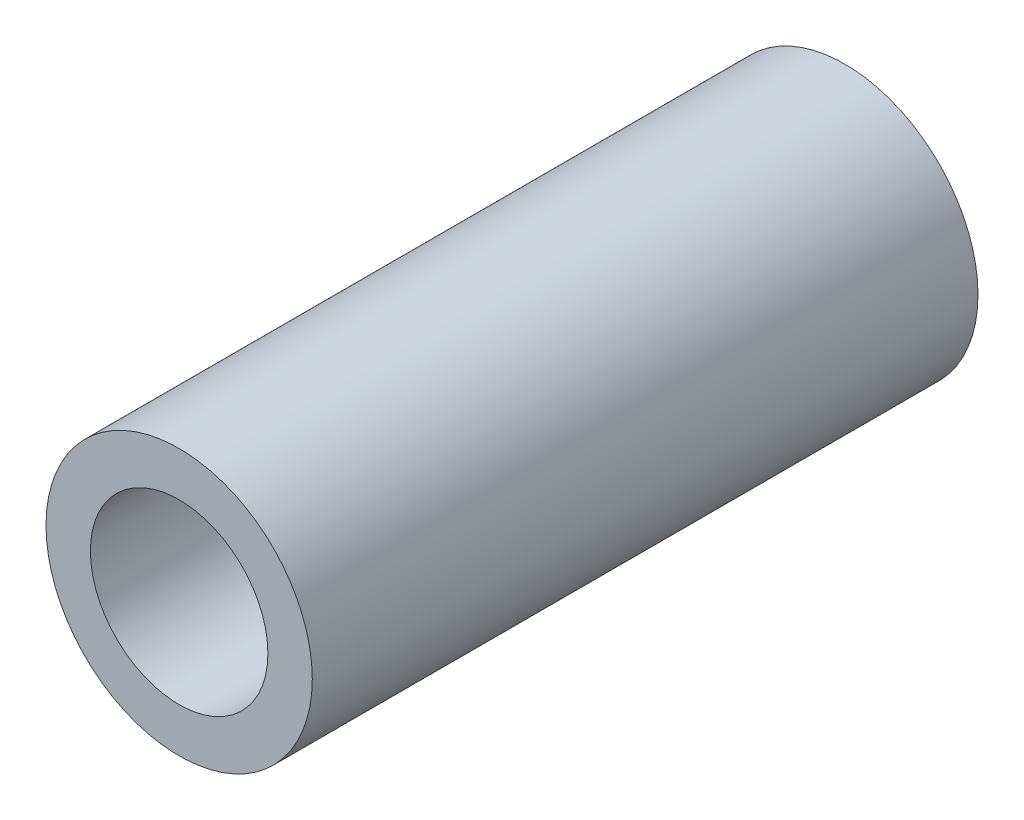
ISO-10303-21;
HEADER;
FILE_DESCRIPTION(('STEP AP214'),'2;1');
FILE_NAME('part.step','',(''),(''),'','','');
FILE_SCHEMA(('AUTOMOTIVE_DESIGN { 1 0 10303 214 1 1 1 1 }'));
ENDSEC;
DATA;
#1=APPLICATION_CONTEXT('core data for automotive mechanical design processes');
#2=APPLICATION_PROTOCOL_DEFINITION('international standard','automotive_design',2000,#1);
#3=PRODUCT_CONTEXT('',#1,'mechanical');
#4=PRODUCT('Part','Part','',(#3));
#5=PRODUCT_RELATED_PRODUCT_CATEGORY('part','',(#4));
#6=PRODUCT_DEFINITION_FORMATION('','',#4);
#7=PRODUCT_DEFINITION_CONTEXT('part definition',#1,'design');
#8=PRODUCT_DEFINITION('design','',#6,#7);
#9=PRODUCT_DEFINITION_SHAPE('','',#8);
#10=(LENGTH_UNIT() NAMED_UNIT(*) SI_UNIT(.MILLI.,.METRE.));
#11=(NAMED_UNIT(*) PLANE_ANGLE_UNIT() SI_UNIT($,.RADIAN.));
#12=(NAMED_UNIT(*) SI_UNIT($,.STERADIAN.) SOLID_ANGLE_UNIT());
#13=UNCERTAINTY_MEASURE_WITH_UNIT(LENGTH_MEASURE(1.E-05),#10,'distance_accuracy_value','');
#14=(GEOMETRIC_REPRESENTATION_CONTEXT(3) GLOBAL_UNCERTAINTY_ASSIGNED_CONTEXT((#13)) GLOBAL_UNIT_ASSIGNED_CONTEXT((#10,
#11,#12)) REPRESENTATION_CONTEXT('',''));
#15=CARTESIAN_POINT('',(0.,0.,0.));
#16=DIRECTION('',(0.,0.,1.));
#17=DIRECTION('',(1.,0.,0.));
#18=AXIS2_PLACEMENT_3D('',#15,#16,#17);
#19=CARTESIAN_POINT('',(0.,0.,7.5));
#20=DIRECTION('',(0.,0.,1.));
#21=DIRECTION('',(1.,0.,0.));
#22=AXIS2_PLACEMENT_3D('',#19,#20,#21);
#23=PLANE('',#22);
#24=CARTESIAN_POINT('',(0.,0.,7.5));
#25=DIRECTION('',(0.,0.,1.));
#26=DIRECTION('',(1.,0.,0.));
#27=AXIS2_PLACEMENT_3D('',#24,#25,#26);
#28=CIRCLE('',#27,3.);
#29=CARTESIAN_POINT('',(3.,0.,7.5));
#30=VERTEX_POINT('',#29);
#31=EDGE_CURVE('E10',#30,#30,#28,.T.);
#32=ORIENTED_EDGE('',*,*,#31,.T.);
#33=EDGE_LOOP('',(#32));
#34=FACE_BOUND('',#33,.T.);
#35=CARTESIAN_POINT('',(0.,0.,7.5));
#36=DIRECTION('',(0.,0.,1.));
#37=DIRECTION('',(1.,0.,0.));
#38=AXIS2_PLACEMENT_3D('',#35,#36,#37);
#39=CIRCLE('',#38,2.);
#40=CARTESIAN_POINT('',(2.,0.,7.5));
#41=VERTEX_POINT('',#40);
#42=EDGE_CURVE('E44',#41,#41,#39,.T.);
#43=ORIENTED_EDGE('',*,*,#42,.F.);
#44=EDGE_LOOP('',(#43));
#45=FACE_BOUND('',#44,.T.);
#46=ADVANCED_FACE('F33',(#34,#45),#23,.T.);
#47=CARTESIAN_POINT('',(0.,0.,-7.5));
#48=DIRECTION('',(0.,0.,1.));
#49=DIRECTION('',(1.,0.,0.));
#50=AXIS2_PLACEMENT_3D('',#47,#48,#49);
#51=PLANE('',#50);
#52=CARTESIAN_POINT('',(0.,0.,-7.5));
#53=DIRECTION('',(0.,0.,1.));
#54=DIRECTION('',(1.,0.,0.));
#55=AXIS2_PLACEMENT_3D('',#52,#53,#54);
#56=CIRCLE('',#55,3.);
#57=CARTESIAN_POINT('',(3.,0.,-7.5));
#58=VERTEX_POINT('',#57);
#59=EDGE_CURVE('E37',#58,#58,#56,.T.);
#60=ORIENTED_EDGE('',*,*,#59,.F.);
#61=EDGE_LOOP('',(#60));
#62=FACE_BOUND('',#61,.T.);
#63=CARTESIAN_POINT('',(0.,0.,-7.5));
#64=DIRECTION('',(0.,0.,1.));
#65=DIRECTION('',(1.,0.,0.));
#66=AXIS2_PLACEMENT_3D('',#63,#64,#65);
#67=CIRCLE('',#66,2.);
#68=CARTESIAN_POINT('',(2.,0.,-7.5));
#69=VERTEX_POINT('',#68);
#70=EDGE_CURVE('E46',#69,#69,#67,.T.);
#71=ORIENTED_EDGE('',*,*,#70,.T.);
#72=EDGE_LOOP('',(#71));
#73=FACE_BOUND('',#72,.T.);
#74=ADVANCED_FACE('F56',(#62,#73),#51,.F.);
#75=CARTESIAN_POINT('',(0.,0.,7.5));
#76=DIRECTION('',(0.,0.,-1.));
#77=DIRECTION('',(-1.,0.,0.));
#78=AXIS2_PLACEMENT_3D('',#75,#76,#77);
#79=CYLINDRICAL_SURFACE('',#78,3.);
#80=ORIENTED_EDGE('',*,*,#31,.F.);
#81=EDGE_LOOP('',(#80));
#82=FACE_BOUND('',#81,.T.);
#83=ORIENTED_EDGE('',*,*,#59,.T.);
#84=EDGE_LOOP('',(#83));
#85=FACE_BOUND('',#84,.T.);
#86=ADVANCED_FACE('F35',(#82,#85),#79,.T.);
#87=CARTESIAN_POINT('',(0.,0.,7.5));
#88=DIRECTION('',(0.,0.,-1.));
#89=DIRECTION('',(-1.,0.,0.));
#90=AXIS2_PLACEMENT_3D('',#87,#88,#89);
#91=CYLINDRICAL_SURFACE('',#90,2.);
#92=ORIENTED_EDGE('',*,*,#42,.T.);
#93=EDGE_LOOP('',(#92));
#94=FACE_BOUND('',#93,.T.);
#95=ORIENTED_EDGE('',*,*,#70,.F.);
#96=EDGE_LOOP('',(#95));
#97=FACE_BOUND('',#96,.T.);
#98=ADVANCED_FACE('F52',(#94,#97),#91,.F.);
#99=CLOSED_SHELL('',(#46,#74,#86,#98));
#100=MANIFOLD_SOLID_BREP('B2',#99);
#101=ADVANCED_BREP_SHAPE_REPRESENTATION('',(#18,#100),#14);
#102=SHAPE_DEFINITION_REPRESENTATION(#9,#101);
ENDSEC;
END-ISO-10303-21;
